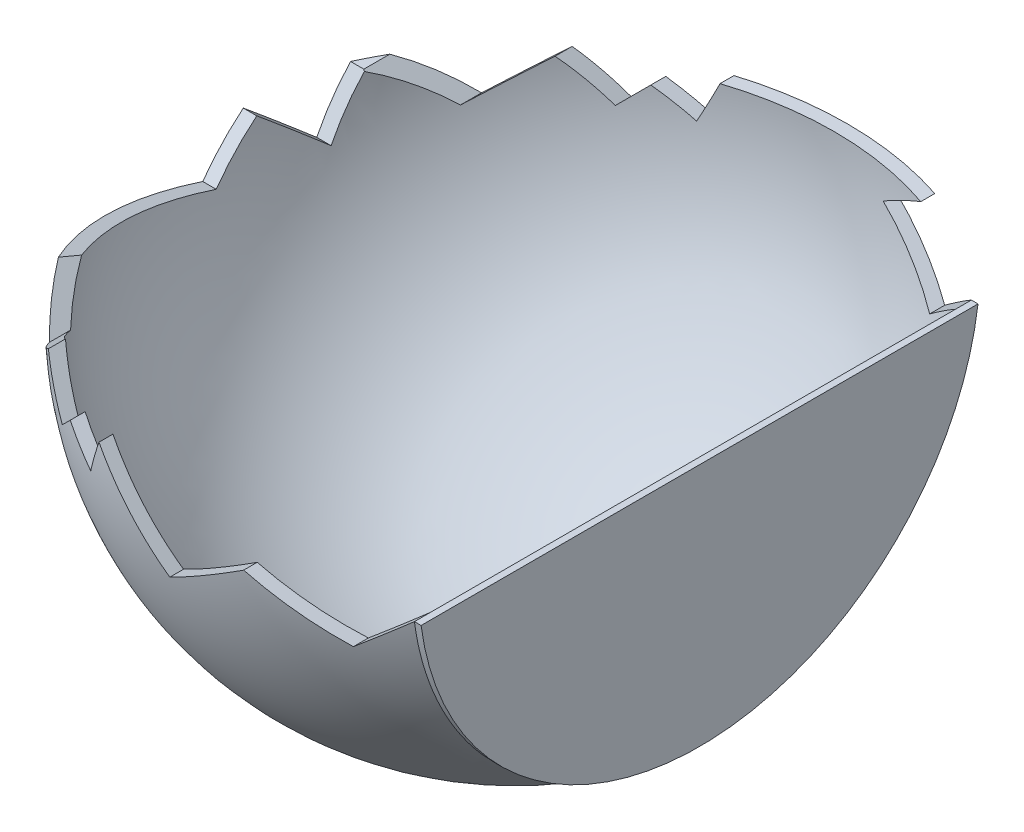
ISO-10303-21;
HEADER;
FILE_DESCRIPTION(('STEP AP214'),'2;1');
FILE_NAME('part.step','',(''),(''),'','','');
FILE_SCHEMA(('AUTOMOTIVE_DESIGN { 1 0 10303 214 1 1 1 1 }'));
ENDSEC;
DATA;
#1=APPLICATION_CONTEXT('core data for automotive mechanical design processes');
#2=APPLICATION_PROTOCOL_DEFINITION('international standard','automotive_design',2000,#1);
#3=PRODUCT_CONTEXT('',#1,'mechanical');
#4=PRODUCT('Part','Part','',(#3));
#5=PRODUCT_RELATED_PRODUCT_CATEGORY('part','',(#4));
#6=PRODUCT_DEFINITION_FORMATION('','',#4);
#7=PRODUCT_DEFINITION_CONTEXT('part definition',#1,'design');
#8=PRODUCT_DEFINITION('design','',#6,#7);
#9=PRODUCT_DEFINITION_SHAPE('','',#8);
#10=(LENGTH_UNIT() NAMED_UNIT(*) SI_UNIT(.MILLI.,.METRE.));
#11=(NAMED_UNIT(*) PLANE_ANGLE_UNIT() SI_UNIT($,.RADIAN.));
#12=(NAMED_UNIT(*) SI_UNIT($,.STERADIAN.) SOLID_ANGLE_UNIT());
#13=UNCERTAINTY_MEASURE_WITH_UNIT(LENGTH_MEASURE(1.E-05),#10,'distance_accuracy_value','');
#14=(GEOMETRIC_REPRESENTATION_CONTEXT(3) GLOBAL_UNCERTAINTY_ASSIGNED_CONTEXT((#13)) GLOBAL_UNIT_ASSIGNED_CONTEXT((#10,
#11,#12)) REPRESENTATION_CONTEXT('',''));
#15=CARTESIAN_POINT('',(0.,0.,0.));
#16=DIRECTION('',(0.,0.,1.));
#17=DIRECTION('',(1.,0.,0.));
#18=AXIS2_PLACEMENT_3D('',#15,#16,#17);
#19=CARTESIAN_POINT('',(0.,0.,0.));
#20=DIRECTION('',(0.,0.,-1.));
#21=DIRECTION('',(-1.,0.,0.));
#22=AXIS2_PLACEMENT_3D('',#19,#20,#21);
#23=SPHERICAL_SURFACE('',#22,50.);
#24=CARTESIAN_POINT('',(13.1016008554718,-16.4144462012753,0.));
#25=DIRECTION('',(0.623824939249041,-0.781564101767047,0.));
#26=DIRECTION('',(0.781564101767047,0.623824939249041,0.));
#27=AXIS2_PLACEMENT_3D('',#24,#25,#26);
#28=CIRCLE('',#27,45.3752576954593);
#29=CARTESIAN_POINT('',(26.7488940986448,-5.52151770176009,-41.8808966805707));
#30=VERTEX_POINT('',#29);
#31=CARTESIAN_POINT('',(20.1507949450474,-10.7879555976998,-44.4698265917994));
#32=VERTEX_POINT('',#31);
#33=EDGE_CURVE('E287',#30,#32,#28,.F.);
#34=ORIENTED_EDGE('',*,*,#33,.F.);
#35=CARTESIAN_POINT('',(26.7488940986448,0.,0.));
#36=DIRECTION('',(1.,0.,0.));
#37=DIRECTION('',(0.,0.,-1.));
#38=AXIS2_PLACEMENT_3D('',#35,#36,#37);
#39=CIRCLE('',#38,42.2433031911507);
#40=CARTESIAN_POINT('',(26.7488940986448,-5.52151770176009,41.8808966805707));
#41=VERTEX_POINT('',#40);
#42=EDGE_CURVE('E229',#30,#41,#39,.F.);
#43=ORIENTED_EDGE('',*,*,#42,.T.);
#44=CARTESIAN_POINT('',(20.1507949450474,-10.7879555976998,44.4698265917994));
#45=VERTEX_POINT('',#44);
#46=EDGE_CURVE('E371',#45,#41,#28,.F.);
#47=ORIENTED_EDGE('',*,*,#46,.F.);
#48=CARTESIAN_POINT('',(0.00667630332438472,0.0124521452759044,0.));
#49=DIRECTION('',(-0.472524466695166,-0.88131755251694,0.));
#50=DIRECTION('',(0.88131755251694,-0.472524466695166,0.));
#51=AXIS2_PLACEMENT_3D('',#48,#49,#50);
#52=CIRCLE('',#51,49.9999980037105);
#53=CARTESIAN_POINT('',(8.29204424355276,-4.42980485522153,49.1082358796121));
#54=VERTEX_POINT('',#53);
#55=EDGE_CURVE('E288',#54,#45,#52,.F.);
#56=ORIENTED_EDGE('',*,*,#55,.F.);
#57=CARTESIAN_POINT('',(4.16590882325636,-6.91542332610695,0.));
#58=DIRECTION('',(0.516011830102366,-0.856581456251772,0.));
#59=DIRECTION('',(0.856581456251772,0.516011830102366,0.));
#60=AXIS2_PLACEMENT_3D('',#57,#58,#59);
#61=CIRCLE('',#60,49.3439167871487);
#62=CARTESIAN_POINT('',(-3.37079886423975,-11.455599042482,48.5531354867503));
#63=VERTEX_POINT('',#62);
#64=EDGE_CURVE('E272',#63,#54,#61,.F.);
#65=ORIENTED_EDGE('',*,*,#64,.F.);
#66=CARTESIAN_POINT('',(-7.41319895336088,-7.41319895336077,0.));
#67=DIRECTION('',(-0.707106781186553,-0.707106781186543,0.));
#68=DIRECTION('',(0.707106781186543,-0.707106781186553,0.));
#69=AXIS2_PLACEMENT_3D('',#66,#67,#68);
#70=CIRCLE('',#69,48.8885361056739);
#71=CARTESIAN_POINT('',(-14.8263979067219,-1.04083408558608E-13,47.7512086246156));
#72=VERTEX_POINT('',#71);
#73=EDGE_CURVE('E275',#72,#63,#70,.F.);
#74=ORIENTED_EDGE('',*,*,#73,.F.);
#75=CARTESIAN_POINT('',(-12.5190832715597,5.3745198903049,0.));
#76=DIRECTION('',(0.918900395359216,-0.394489623955657,0.));
#77=DIRECTION('',(0.394489623955657,0.918900395359217,0.));
#78=AXIS2_PLACEMENT_3D('',#75,#76,#77);
#79=CIRCLE('',#78,48.1080771803288);
#80=CARTESIAN_POINT('',(-17.1772320436909,-5.47589159943955,46.6364375838076));
#81=VERTEX_POINT('',#80);
#82=EDGE_CURVE('E328',#81,#72,#79,.F.);
#83=ORIENTED_EDGE('',*,*,#82,.F.);
#84=CARTESIAN_POINT('',(-7.59457472056228,-11.6974410011386,0.));
#85=DIRECTION('',(-0.544546624083518,-0.838730573068159,0.));
#86=DIRECTION('',(0.83873057306816,-0.544546624083519,0.));
#87=AXIS2_PLACEMENT_3D('',#84,#85,#86);
#88=CIRCLE('',#87,48.0155423674322);
#89=CARTESIAN_POINT('',(-22.1167261591984,-2.26892033637887,44.7850692140382));
#90=VERTEX_POINT('',#89);
#91=EDGE_CURVE('E322',#90,#81,#88,.F.);
#92=ORIENTED_EDGE('',*,*,#91,.F.);
#93=CARTESIAN_POINT('',(-9.92390291141004,9.92390291140981,0.));
#94=DIRECTION('',(0.707106781186556,-0.707106781186539,0.));
#95=DIRECTION('',(0.707106781186539,0.707106781186556,0.));
#96=AXIS2_PLACEMENT_3D('',#93,#94,#95);
#97=CIRCLE('',#96,47.9899187539406);
#98=CARTESIAN_POINT('',(-25.323697422259,-5.47589159943955,42.7635938627363));
#99=VERTEX_POINT('',#98);
#100=EDGE_CURVE('E325',#99,#90,#97,.F.);
#101=ORIENTED_EDGE('',*,*,#100,.F.);
#102=CARTESIAN_POINT('',(-15.399794510849,-15.3997945108494,0.));
#103=DIRECTION('',(-0.707106781186539,-0.707106781186556,0.));
#104=DIRECTION('',(0.707106781186556,-0.707106781186539,0.));
#105=AXIS2_PLACEMENT_3D('',#102,#103,#104);
#106=CIRCLE('',#105,45.0076955425096);
#107=CARTESIAN_POINT('',(-30.7995890216985,-2.1163626406917E-13,39.3876289727431));
#108=VERTEX_POINT('',#107);
#109=EDGE_CURVE('E335',#108,#99,#106,.F.);
#110=ORIENTED_EDGE('',*,*,#109,.F.);
#111=CARTESIAN_POINT('',(-13.5582273830077,15.2892871478703,0.));
#112=DIRECTION('',(0.663481771908503,-0.748192447399165,0.));
#113=DIRECTION('',(0.748192447399165,0.663481771908503,0.));
#114=AXIS2_PLACEMENT_3D('',#111,#112,#113);
#115=CIRCLE('',#114,45.6334544905448);
#116=CARTESIAN_POINT('',(-37.528853710113,-5.96737440297733,32.4957779094397));
#117=VERTEX_POINT('',#116);
#118=EDGE_CURVE('E305',#117,#108,#115,.F.);
#119=ORIENTED_EDGE('',*,*,#118,.F.);
#120=CARTESIAN_POINT('',(-21.7481140565447,-21.7481140565452,0.));
#121=DIRECTION('',(-0.707106781186539,-0.707106781186556,0.));
#122=DIRECTION('',(0.707106781186556,-0.707106781186539,0.));
#123=AXIS2_PLACEMENT_3D('',#120,#121,#122);
#124=CIRCLE('',#123,39.4213022358093);
#125=CARTESIAN_POINT('',(-42.7348367923648,-0.76139132072567,25.9452116504505));
#126=VERTEX_POINT('',#125);
#127=EDGE_CURVE('E309',#126,#117,#124,.F.);
#128=ORIENTED_EDGE('',*,*,#127,.F.);
#129=CARTESIAN_POINT('',(0.,-7.16199971348181,1.9070129164996));
#130=DIRECTION('',(0.,-0.966330731100568,0.25730316385665));
#131=DIRECTION('',(0.,-0.25730316385665,-0.966330731100568));
#132=AXIS2_PLACEMENT_3D('',#129,#130,#131);
#133=CIRCLE('',#132,49.4476395982699);
#134=CARTESIAN_POINT('',(-49.2573386848287,-8.27715434258795,-2.28107467590438));
#135=VERTEX_POINT('',#134);
#136=EDGE_CURVE('E376',#135,#126,#133,.F.);
#137=ORIENTED_EDGE('',*,*,#136,.F.);
#138=CARTESIAN_POINT('',(0.,-5.01001590290923,-5.34401696310318));
#139=DIRECTION('',(0.,-0.68394112888133,-0.729537204140085));
#140=DIRECTION('',(0.,0.729537204140085,-0.68394112888133));
#141=AXIS2_PLACEMENT_3D('',#138,#139,#140);
#142=CIRCLE('',#141,49.4605016487971);
#143=CARTESIAN_POINT('',(-49.2603391991137,-1.76704411099221,-8.38430301802538));
#144=VERTEX_POINT('',#143);
#145=EDGE_CURVE('E374',#144,#135,#142,.F.);
#146=ORIENTED_EDGE('',*,*,#145,.F.);
#147=CARTESIAN_POINT('',(0.,2.9949732792852,-2.37225606280016));
#148=DIRECTION('',(0.,-0.78388842022198,0.620901718987707));
#149=DIRECTION('',(0.,-0.620901718987707,-0.78388842022198));
#150=AXIS2_PLACEMENT_3D('',#147,#148,#149);
#151=CIRCLE('',#150,49.8538116519577);
#152=CARTESIAN_POINT('',(-46.4307933857422,-8.27715434258795,-16.603317185415));
#153=VERTEX_POINT('',#152);
#154=EDGE_CURVE('E356',#153,#144,#151,.F.);
#155=ORIENTED_EDGE('',*,*,#154,.F.);
#156=CARTESIAN_POINT('',(0.,-8.3153587765948,-16.5841613433409));
#157=DIRECTION('',(0.,-0.448217108907809,-0.893924730210729));
#158=DIRECTION('',(0.,0.893924730210729,-0.448217108907809));
#159=AXIS2_PLACEMENT_3D('',#156,#157,#158);
#160=CIRCLE('',#159,46.4308130550666);
#161=CARTESIAN_POINT('',(-45.4894682388491,2.35092416057263E-13,-20.7535124580573));
#162=VERTEX_POINT('',#161);
#163=EDGE_CURVE('E381',#162,#153,#160,.F.);
#164=ORIENTED_EDGE('',*,*,#163,.F.);
#165=CARTESIAN_POINT('',(0.,0.,0.));
#166=DIRECTION('',(0.,-1.,0.));
#167=DIRECTION('',(0.,0.,1.));
#168=AXIS2_PLACEMENT_3D('',#165,#166,#167);
#169=CIRCLE('',#168,50.);
#170=CARTESIAN_POINT('',(-43.4962281130902,-3.03732537533837E-13,-24.6592404573625));
#171=VERTEX_POINT('',#170);
#172=EDGE_CURVE('E271',#162,#171,#169,.T.);
#173=ORIENTED_EDGE('',*,*,#172,.T.);
#174=CARTESIAN_POINT('',(-37.528853710113,-5.96737440297733,-32.4957779094397));
#175=VERTEX_POINT('',#174);
#176=EDGE_CURVE('E308',#175,#171,#124,.F.);
#177=ORIENTED_EDGE('',*,*,#176,.F.);
#178=CARTESIAN_POINT('',(-30.7995890216985,-2.15072380626596E-13,-39.3876289727431));
#179=VERTEX_POINT('',#178);
#180=EDGE_CURVE('E298',#179,#175,#115,.F.);
#181=ORIENTED_EDGE('',*,*,#180,.F.);
#182=CARTESIAN_POINT('',(-25.323697422259,-5.47589159943955,-42.7635938627363));
#183=VERTEX_POINT('',#182);
#184=EDGE_CURVE('E334',#183,#179,#106,.F.);
#185=ORIENTED_EDGE('',*,*,#184,.F.);
#186=CARTESIAN_POINT('',(-22.1167261591984,-2.26892033637887,-44.7850692140382));
#187=VERTEX_POINT('',#186);
#188=EDGE_CURVE('E324',#187,#183,#97,.F.);
#189=ORIENTED_EDGE('',*,*,#188,.F.);
#190=CARTESIAN_POINT('',(-17.1772320436909,-5.47589159943955,-46.6364375838076));
#191=VERTEX_POINT('',#190);
#192=EDGE_CURVE('E314',#191,#187,#88,.F.);
#193=ORIENTED_EDGE('',*,*,#192,.F.);
#194=CARTESIAN_POINT('',(-14.8263979067219,-1.03532183227165E-13,-47.7512086246155));
#195=VERTEX_POINT('',#194);
#196=EDGE_CURVE('E327',#195,#191,#79,.F.);
#197=ORIENTED_EDGE('',*,*,#196,.F.);
#198=CARTESIAN_POINT('',(15.6455359126181,1.09252193350212E-13,-47.4891272398954));
#199=VERTEX_POINT('',#198);
#200=EDGE_CURVE('E368',#195,#199,#169,.T.);
#201=ORIENTED_EDGE('',*,*,#200,.T.);
#202=CARTESIAN_POINT('',(4.16590882325637,-6.91542332610695,0.));
#203=DIRECTION('',(-0.516011830102366,0.856581456251772,0.));
#204=DIRECTION('',(-0.856581456251772,-0.516011830102367,0.));
#205=AXIS2_PLACEMENT_3D('',#202,#203,#204);
#206=CIRCLE('',#205,49.3439167871487);
#207=CARTESIAN_POINT('',(8.29204424355276,-4.42980485522153,-49.1082358796121));
#208=VERTEX_POINT('',#207);
#209=EDGE_CURVE('E282',#208,#199,#206,.F.);
#210=ORIENTED_EDGE('',*,*,#209,.F.);
#211=EDGE_CURVE('E291',#32,#208,#52,.F.);
#212=ORIENTED_EDGE('',*,*,#211,.F.);
#213=EDGE_LOOP('',(#34,#43,#47,#56,#65,#74,#83,#92,#101,#110,#119,#128,#137,#146,#155,#164,#173,
#177,#181,#185,#189,#193,#197,#201,#210,#212));
#214=FACE_BOUND('',#213,.T.);
#215=ADVANCED_FACE('F34',(#214),#23,.T.);
#216=CARTESIAN_POINT('',(0.,0.,0.));
#217=DIRECTION('',(0.,0.,-1.));
#218=DIRECTION('',(-1.,0.,0.));
#219=AXIS2_PLACEMENT_3D('',#216,#217,#218);
#220=SPHERICAL_SURFACE('',#219,48.);
#221=CARTESIAN_POINT('',(26.7488940986448,0.,0.));
#222=DIRECTION('',(1.,0.,0.));
#223=DIRECTION('',(0.,0.,-1.));
#224=AXIS2_PLACEMENT_3D('',#221,#222,#223);
#225=CIRCLE('',#224,39.8559489223313);
#226=CARTESIAN_POINT('',(26.7488940986448,-5.52151770176009,-39.4716291375038));
#227=VERTEX_POINT('',#226);
#228=CARTESIAN_POINT('',(26.7488940986448,-5.52151770176009,39.4716291375037));
#229=VERTEX_POINT('',#228);
#230=EDGE_CURVE('E359',#227,#229,#225,.F.);
#231=ORIENTED_EDGE('',*,*,#230,.F.);
#232=CARTESIAN_POINT('',(13.1016008554718,-16.4144462012753,0.));
#233=DIRECTION('',(0.623824939249041,-0.781564101767047,0.));
#234=DIRECTION('',(0.781564101767047,0.623824939249041,0.));
#235=AXIS2_PLACEMENT_3D('',#232,#233,#234);
#236=CIRCLE('',#235,43.1614875893932);
#237=CARTESIAN_POINT('',(20.1507949450474,-10.7879555976998,-42.2085948250437));
#238=VERTEX_POINT('',#237);
#239=EDGE_CURVE('E260',#227,#238,#236,.F.);
#240=ORIENTED_EDGE('',*,*,#239,.T.);
#241=CARTESIAN_POINT('',(0.00667630332438472,0.0124521452759044,0.));
#242=DIRECTION('',(-0.472524466695166,-0.88131755251694,0.));
#243=DIRECTION('',(0.88131755251694,-0.472524466695166,0.));
#244=AXIS2_PLACEMENT_3D('',#241,#242,#243);
#245=CIRCLE('',#244,47.9999979205317);
#246=CARTESIAN_POINT('',(8.29204424355276,-4.42980485522153,-47.070360432098));
#247=VERTEX_POINT('',#246);
#248=EDGE_CURVE('E290',#238,#247,#245,.F.);
#249=ORIENTED_EDGE('',*,*,#248,.T.);
#250=CARTESIAN_POINT('',(4.16590882325637,-6.91542332610695,0.));
#251=DIRECTION('',(-0.516011830102366,0.856581456251772,0.));
#252=DIRECTION('',(-0.856581456251772,-0.516011830102367,0.));
#253=AXIS2_PLACEMENT_3D('',#250,#251,#252);
#254=CIRCLE('',#253,47.3161930410409);
#255=CARTESIAN_POINT('',(15.6455359126181,1.09252193350212E-13,-45.3785985460875));
#256=VERTEX_POINT('',#255);
#257=EDGE_CURVE('E257',#247,#256,#254,.F.);
#258=ORIENTED_EDGE('',*,*,#257,.T.);
#259=CARTESIAN_POINT('',(0.,0.,0.));
#260=DIRECTION('',(0.,-1.,0.));
#261=DIRECTION('',(1.,0.,0.));
#262=AXIS2_PLACEMENT_3D('',#259,#260,#261);
#263=CIRCLE('',#262,48.);
#264=CARTESIAN_POINT('',(-14.8263979067219,-1.03532183227165E-13,-45.6527975606266));
#265=VERTEX_POINT('',#264);
#266=EDGE_CURVE('E276',#265,#256,#263,.T.);
#267=ORIENTED_EDGE('',*,*,#266,.F.);
#268=CARTESIAN_POINT('',(-12.5190832715597,5.3745198903049,0.));
#269=DIRECTION('',(0.918900395359216,-0.394489623955657,0.));
#270=DIRECTION('',(0.394489623955657,0.918900395359217,0.));
#271=AXIS2_PLACEMENT_3D('',#268,#269,#270);
#272=CIRCLE('',#271,46.0259393167426);
#273=CARTESIAN_POINT('',(-17.1772320436909,-5.47589159943955,-44.4854730278142));
#274=VERTEX_POINT('',#273);
#275=EDGE_CURVE('E330',#265,#274,#272,.F.);
#276=ORIENTED_EDGE('',*,*,#275,.T.);
#277=CARTESIAN_POINT('',(-7.59457472056228,-11.6974410011386,0.));
#278=DIRECTION('',(-0.544546624083518,-0.838730573068159,0.));
#279=DIRECTION('',(0.83873057306816,-0.544546624083519,0.));
#280=AXIS2_PLACEMENT_3D('',#277,#278,#279);
#281=CIRCLE('',#280,45.9292097563052);
#282=CARTESIAN_POINT('',(-22.1167261591984,-2.26892033637887,-42.5405973689392));
#283=VERTEX_POINT('',#282);
#284=EDGE_CURVE('E242',#274,#283,#281,.F.);
#285=ORIENTED_EDGE('',*,*,#284,.T.);
#286=CARTESIAN_POINT('',(-9.92390291141004,9.92390291140981,0.));
#287=DIRECTION('',(0.707106781186556,-0.707106781186539,0.));
#288=DIRECTION('',(0.707106781186539,0.707106781186556,0.));
#289=AXIS2_PLACEMENT_3D('',#286,#287,#288);
#290=CIRCLE('',#289,45.9024215266452);
#291=CARTESIAN_POINT('',(-25.323697422259,-5.47589159943955,-40.4069914749547));
#292=VERTEX_POINT('',#291);
#293=EDGE_CURVE('E247',#283,#292,#290,.F.);
#294=ORIENTED_EDGE('',*,*,#293,.T.);
#295=CARTESIAN_POINT('',(-15.399794510849,-15.3997945108494,0.));
#296=DIRECTION('',(-0.707106781186539,-0.707106781186556,0.));
#297=DIRECTION('',(0.707106781186556,-0.707106781186539,0.));
#298=AXIS2_PLACEMENT_3D('',#295,#296,#297);
#299=CIRCLE('',#298,42.7749068736244);
#300=CARTESIAN_POINT('',(-30.7995890216985,-2.1163626406917E-13,-36.8155580712077));
#301=VERTEX_POINT('',#300);
#302=EDGE_CURVE('E337',#292,#301,#299,.F.);
#303=ORIENTED_EDGE('',*,*,#302,.T.);
#304=CARTESIAN_POINT('',(-13.5582273830077,15.2892871478703,0.));
#305=DIRECTION('',(0.663481771908503,-0.748192447399165,0.));
#306=DIRECTION('',(0.748192447399165,0.663481771908503,0.));
#307=AXIS2_PLACEMENT_3D('',#304,#305,#306);
#308=CIRCLE('',#307,43.4328466571169);
#309=CARTESIAN_POINT('',(-37.528853710113,-5.96737440297733,-29.3253402698013));
#310=VERTEX_POINT('',#309);
#311=EDGE_CURVE('E250',#301,#310,#308,.F.);
#312=ORIENTED_EDGE('',*,*,#311,.T.);
#313=CARTESIAN_POINT('',(-21.7481140565447,-21.7481140565452,0.));
#314=DIRECTION('',(-0.707106781186539,-0.707106781186556,0.));
#315=DIRECTION('',(0.707106781186556,-0.707106781186539,0.));
#316=AXIS2_PLACEMENT_3D('',#313,#314,#315);
#317=CIRCLE('',#316,36.851581648106);
#318=CARTESIAN_POINT('',(-43.32278531579,-0.173442797300485,-20.6665476090719));
#319=VERTEX_POINT('',#318);
#320=EDGE_CURVE('E255',#310,#319,#317,.F.);
#321=ORIENTED_EDGE('',*,*,#320,.T.);
#322=CARTESIAN_POINT('',(0.,-8.3153587765948,-16.5841613433409));
#323=DIRECTION('',(0.,-0.448217108907809,-0.893924730210729));
#324=DIRECTION('',(0.,0.893924730210729,-0.448217108907809));
#325=AXIS2_PLACEMENT_3D('',#322,#323,#324);
#326=CIRCLE('',#325,44.2698588314278);
#327=CARTESIAN_POINT('',(-44.2698382019799,-8.27715434258795,-16.603317185415));
#328=VERTEX_POINT('',#327);
#329=EDGE_CURVE('E383',#319,#328,#326,.F.);
#330=ORIENTED_EDGE('',*,*,#329,.T.);
#331=CARTESIAN_POINT('',(0.,2.9949732792852,-2.37225606280016));
#332=DIRECTION('',(0.,-0.78388842022198,0.620901718987707));
#333=DIRECTION('',(0.,-0.620901718987707,-0.78388842022198));
#334=AXIS2_PLACEMENT_3D('',#331,#332,#333);
#335=CIRCLE('',#334,47.8477014727863);
#336=CARTESIAN_POINT('',(-47.229027282083,-1.76704411099221,-8.38430301802538));
#337=VERTEX_POINT('',#336);
#338=EDGE_CURVE('E358',#328,#337,#335,.F.);
#339=ORIENTED_EDGE('',*,*,#338,.T.);
#340=CARTESIAN_POINT('',(0.,-5.01001590290923,-5.34401696310318));
#341=DIRECTION('',(0.,-0.68394112888133,-0.729537204140085));
#342=DIRECTION('',(0.,0.729537204140085,-0.68394112888133));
#343=AXIS2_PLACEMENT_3D('',#340,#341,#342);
#344=CIRCLE('',#343,47.4377615760974);
#345=CARTESIAN_POINT('',(-47.2258977078459,-8.27715434258795,-2.28107467590438));
#346=VERTEX_POINT('',#345);
#347=EDGE_CURVE('E240',#337,#346,#344,.F.);
#348=ORIENTED_EDGE('',*,*,#347,.T.);
#349=CARTESIAN_POINT('',(0.,-7.16199971348181,1.9070129164996));
#350=DIRECTION('',(0.,-0.966330731100568,0.25730316385665));
#351=DIRECTION('',(0.,-0.25730316385665,-0.966330731100568));
#352=AXIS2_PLACEMENT_3D('',#349,#350,#351);
#353=CIRCLE('',#352,47.4243509374708);
#354=CARTESIAN_POINT('',(-42.0007689135171,-1.49545919957331,23.1883378545282));
#355=VERTEX_POINT('',#354);
#356=EDGE_CURVE('E378',#346,#355,#353,.F.);
#357=ORIENTED_EDGE('',*,*,#356,.T.);
#358=CARTESIAN_POINT('',(-37.528853710113,-5.96737440297733,29.3253402698013));
#359=VERTEX_POINT('',#358);
#360=EDGE_CURVE('E254',#355,#359,#317,.F.);
#361=ORIENTED_EDGE('',*,*,#360,.T.);
#362=CARTESIAN_POINT('',(-30.7995890216985,-2.15072380626596E-13,36.8155580712077));
#363=VERTEX_POINT('',#362);
#364=EDGE_CURVE('E251',#359,#363,#308,.F.);
#365=ORIENTED_EDGE('',*,*,#364,.T.);
#366=CARTESIAN_POINT('',(-25.323697422259,-5.47589159943955,40.4069914749547));
#367=VERTEX_POINT('',#366);
#368=EDGE_CURVE('E338',#363,#367,#299,.F.);
#369=ORIENTED_EDGE('',*,*,#368,.T.);
#370=CARTESIAN_POINT('',(-22.1167261591984,-2.26892033637887,42.5405973689392));
#371=VERTEX_POINT('',#370);
#372=EDGE_CURVE('E246',#367,#371,#290,.F.);
#373=ORIENTED_EDGE('',*,*,#372,.T.);
#374=CARTESIAN_POINT('',(-17.1772320436909,-5.47589159943955,44.4854730278142));
#375=VERTEX_POINT('',#374);
#376=EDGE_CURVE('E243',#371,#375,#281,.F.);
#377=ORIENTED_EDGE('',*,*,#376,.T.);
#378=CARTESIAN_POINT('',(-14.8263979067219,-1.04083408558608E-13,45.6527975606266));
#379=VERTEX_POINT('',#378);
#380=EDGE_CURVE('E331',#375,#379,#272,.F.);
#381=ORIENTED_EDGE('',*,*,#380,.T.);
#382=CARTESIAN_POINT('',(-7.41319895336088,-7.41319895336077,0.));
#383=DIRECTION('',(-0.707106781186553,-0.707106781186543,0.));
#384=DIRECTION('',(0.707106781186543,-0.707106781186553,0.));
#385=AXIS2_PLACEMENT_3D('',#382,#383,#384);
#386=CIRCLE('',#385,46.8411033447738);
#387=CARTESIAN_POINT('',(-3.37079886423975,-11.455599042482,46.4909342301779));
#388=VERTEX_POINT('',#387);
#389=EDGE_CURVE('E268',#379,#388,#386,.F.);
#390=ORIENTED_EDGE('',*,*,#389,.T.);
#391=CARTESIAN_POINT('',(4.16590882325636,-6.91542332610695,0.));
#392=DIRECTION('',(0.516011830102366,-0.856581456251772,0.));
#393=DIRECTION('',(0.856581456251772,0.516011830102366,0.));
#394=AXIS2_PLACEMENT_3D('',#391,#392,#393);
#395=CIRCLE('',#394,47.3161930410409);
#396=CARTESIAN_POINT('',(8.29204424355276,-4.42980485522153,47.070360432098));
#397=VERTEX_POINT('',#396);
#398=EDGE_CURVE('E264',#388,#397,#395,.F.);
#399=ORIENTED_EDGE('',*,*,#398,.T.);
#400=CARTESIAN_POINT('',(20.1507949450474,-10.7879555976998,42.2085948250437));
#401=VERTEX_POINT('',#400);
#402=EDGE_CURVE('E292',#397,#401,#245,.F.);
#403=ORIENTED_EDGE('',*,*,#402,.T.);
#404=EDGE_CURVE('E265',#401,#229,#236,.F.);
#405=ORIENTED_EDGE('',*,*,#404,.T.);
#406=EDGE_LOOP('',(#231,#240,#249,#258,#267,#276,#285,#294,#303,#312,#321,#330,#339,#348,#357,
#361,#365,#369,#373,#377,#381,#390,#399,#403,#405));
#407=FACE_BOUND('',#406,.T.);
#408=ADVANCED_FACE('F400',(#407),#220,.F.);
#409=CARTESIAN_POINT('',(20.1507949450474,-10.7879555976998,-50.));
#410=DIRECTION('',(0.623824939249041,-0.781564101767047,0.));
#411=DIRECTION('',(0.781564101767047,0.623824939249041,0.));
#412=AXIS2_PLACEMENT_3D('',#409,#410,#411);
#413=PLANE('',#412);
#414=DIRECTION('',(0.,0.,1.));
#415=VECTOR('',#414,1.);
#416=CARTESIAN_POINT('',(26.7488940986448,-5.52151770176009,-50.));
#417=LINE('',#416,#415);
#418=EDGE_CURVE('E232',#229,#41,#417,.T.);
#419=ORIENTED_EDGE('',*,*,#418,.F.);
#420=ORIENTED_EDGE('',*,*,#404,.F.);
#421=DIRECTION('',(0.,0.,1.));
#422=VECTOR('',#421,1.);
#423=CARTESIAN_POINT('',(20.1507949450474,-10.7879555976998,-50.));
#424=LINE('',#423,#422);
#425=EDGE_CURVE('E299',#401,#45,#424,.T.);
#426=ORIENTED_EDGE('',*,*,#425,.T.);
#427=ORIENTED_EDGE('',*,*,#46,.T.);
#428=EDGE_LOOP('',(#419,#420,#426,#427));
#429=FACE_BOUND('',#428,.T.);
#430=ADVANCED_FACE('F36',(#429),#413,.F.);
#431=DIRECTION('',(0.,0.,1.));
#432=VECTOR('',#431,1.);
#433=CARTESIAN_POINT('',(26.7488940986448,-5.52151770176009,-50.));
#434=LINE('',#433,#432);
#435=EDGE_CURVE('E230',#30,#227,#434,.T.);
#436=ORIENTED_EDGE('',*,*,#435,.F.);
#437=ORIENTED_EDGE('',*,*,#33,.T.);
#438=EDGE_CURVE('E302',#32,#238,#424,.T.);
#439=ORIENTED_EDGE('',*,*,#438,.T.);
#440=ORIENTED_EDGE('',*,*,#239,.F.);
#441=EDGE_LOOP('',(#436,#437,#439,#440));
#442=FACE_BOUND('',#441,.T.);
#443=ADVANCED_FACE('F466',(#442),#413,.F.);
#444=CARTESIAN_POINT('',(0.,0.,0.));
#445=DIRECTION('',(0.,-1.,0.));
#446=DIRECTION('',(0.,0.,1.));
#447=AXIS2_PLACEMENT_3D('',#444,#445,#446);
#448=PLANE('',#447);
#449=ORIENTED_EDGE('',*,*,#200,.F.);
#450=DIRECTION('',(0.,0.,1.));
#451=VECTOR('',#450,1.);
#452=CARTESIAN_POINT('',(-14.8263979067219,-1.04083408558608E-13,-50.));
#453=LINE('',#452,#451);
#454=EDGE_CURVE('E345',#195,#265,#453,.T.);
#455=ORIENTED_EDGE('',*,*,#454,.T.);
#456=ORIENTED_EDGE('',*,*,#266,.T.);
#457=DIRECTION('',(0.,0.,1.));
#458=VECTOR('',#457,1.);
#459=CARTESIAN_POINT('',(15.6455359126181,1.09252193350212E-13,-50.));
#460=LINE('',#459,#458);
#461=EDGE_CURVE('E295',#199,#256,#460,.T.);
#462=ORIENTED_EDGE('',*,*,#461,.F.);
#463=EDGE_LOOP('',(#449,#455,#456,#462));
#464=FACE_BOUND('',#463,.T.);
#465=ADVANCED_FACE('F450',(#464),#448,.F.);
#466=ORIENTED_EDGE('',*,*,#172,.F.);
#467=DIRECTION('',(1.,0.,0.));
#468=VECTOR('',#467,1.);
#469=CARTESIAN_POINT('',(-100.,2.35922392732846E-13,-20.7535124580573));
#470=LINE('',#469,#468);
#471=CARTESIAN_POINT('',(-43.4962281130907,2.35922392732846E-13,-20.7535124580573));
#472=VERTEX_POINT('',#471);
#473=EDGE_CURVE('E12',#162,#472,#470,.T.);
#474=ORIENTED_EDGE('',*,*,#473,.T.);
#475=DIRECTION('',(0.,0.,1.));
#476=VECTOR('',#475,1.);
#477=CARTESIAN_POINT('',(-43.4962281130902,-3.05311331771918E-13,-50.));
#478=LINE('',#477,#476);
#479=EDGE_CURVE('E316',#171,#472,#478,.T.);
#480=ORIENTED_EDGE('',*,*,#479,.F.);
#481=EDGE_LOOP('',(#466,#474,#480));
#482=FACE_BOUND('',#481,.T.);
#483=ADVANCED_FACE('F414',(#482),#448,.F.);
#484=CARTESIAN_POINT('',(-3.37079886423975,-11.455599042482,40.));
#485=DIRECTION('',(0.516011830102366,-0.856581456251772,0.));
#486=DIRECTION('',(0.856581456251772,0.516011830102366,0.));
#487=AXIS2_PLACEMENT_3D('',#484,#485,#486);
#488=PLANE('',#487);
#489=ORIENTED_EDGE('',*,*,#64,.T.);
#490=DIRECTION('',(0.,0.,-1.));
#491=VECTOR('',#490,1.);
#492=CARTESIAN_POINT('',(8.29204424355276,-4.42980485522153,40.));
#493=LINE('',#492,#491);
#494=EDGE_CURVE('E261',#54,#397,#493,.T.);
#495=ORIENTED_EDGE('',*,*,#494,.T.);
#496=ORIENTED_EDGE('',*,*,#398,.F.);
#497=DIRECTION('',(0.,0.,1.));
#498=VECTOR('',#497,1.);
#499=CARTESIAN_POINT('',(-3.37079886423975,-11.455599042482,40.));
#500=LINE('',#499,#498);
#501=EDGE_CURVE('E278',#388,#63,#500,.T.);
#502=ORIENTED_EDGE('',*,*,#501,.T.);
#503=EDGE_LOOP('',(#489,#495,#496,#502));
#504=FACE_BOUND('',#503,.T.);
#505=ADVANCED_FACE('F480',(#504),#488,.F.);
#506=CARTESIAN_POINT('',(-14.8263979067219,3.35182208528941E-13,40.));
#507=DIRECTION('',(-0.707106781186553,-0.707106781186543,0.));
#508=DIRECTION('',(0.707106781186543,-0.707106781186553,0.));
#509=AXIS2_PLACEMENT_3D('',#506,#507,#508);
#510=PLANE('',#509);
#511=ORIENTED_EDGE('',*,*,#73,.T.);
#512=ORIENTED_EDGE('',*,*,#501,.F.);
#513=ORIENTED_EDGE('',*,*,#389,.F.);
#514=DIRECTION('',(0.,0.,1.));
#515=VECTOR('',#514,1.);
#516=CARTESIAN_POINT('',(-14.8263979067219,3.35182208528941E-13,40.));
#517=LINE('',#516,#515);
#518=EDGE_CURVE('E279',#379,#72,#517,.T.);
#519=ORIENTED_EDGE('',*,*,#518,.T.);
#520=EDGE_LOOP('',(#511,#512,#513,#519));
#521=FACE_BOUND('',#520,.T.);
#522=ADVANCED_FACE('F486',(#521),#510,.F.);
#523=CARTESIAN_POINT('',(8.29204424355276,-4.42980485522153,-50.));
#524=DIRECTION('',(-0.472524466695166,-0.88131755251694,0.));
#525=DIRECTION('',(0.88131755251694,-0.472524466695166,0.));
#526=AXIS2_PLACEMENT_3D('',#523,#524,#525);
#527=PLANE('',#526);
#528=ORIENTED_EDGE('',*,*,#55,.T.);
#529=ORIENTED_EDGE('',*,*,#425,.F.);
#530=ORIENTED_EDGE('',*,*,#402,.F.);
#531=ORIENTED_EDGE('',*,*,#494,.F.);
#532=EDGE_LOOP('',(#528,#529,#530,#531));
#533=FACE_BOUND('',#532,.T.);
#534=ADVANCED_FACE('F478',(#533),#527,.F.);
#535=CARTESIAN_POINT('',(8.29204424355276,-4.42980485522153,-50.));
#536=DIRECTION('',(-0.516011830102366,0.856581456251772,0.));
#537=DIRECTION('',(-0.856581456251772,-0.516011830102367,0.));
#538=AXIS2_PLACEMENT_3D('',#535,#536,#537);
#539=PLANE('',#538);
#540=ORIENTED_EDGE('',*,*,#209,.T.);
#541=ORIENTED_EDGE('',*,*,#461,.T.);
#542=ORIENTED_EDGE('',*,*,#257,.F.);
#543=DIRECTION('',(0.,0.,1.));
#544=VECTOR('',#543,1.);
#545=CARTESIAN_POINT('',(8.29204424355276,-4.42980485522153,-50.));
#546=LINE('',#545,#544);
#547=EDGE_CURVE('E296',#208,#247,#546,.T.);
#548=ORIENTED_EDGE('',*,*,#547,.F.);
#549=EDGE_LOOP('',(#540,#541,#542,#548));
#550=FACE_BOUND('',#549,.T.);
#551=ADVANCED_FACE('F454',(#550),#539,.F.);
#552=ORIENTED_EDGE('',*,*,#211,.T.);
#553=ORIENTED_EDGE('',*,*,#547,.T.);
#554=ORIENTED_EDGE('',*,*,#248,.F.);
#555=ORIENTED_EDGE('',*,*,#438,.F.);
#556=EDGE_LOOP('',(#552,#553,#554,#555));
#557=FACE_BOUND('',#556,.T.);
#558=ADVANCED_FACE('F462',(#557),#527,.F.);
#559=CARTESIAN_POINT('',(-21.7481140565447,-21.7481140565452,-50.));
#560=DIRECTION('',(-0.707106781186539,-0.707106781186556,0.));
#561=DIRECTION('',(0.707106781186556,-0.707106781186539,0.));
#562=AXIS2_PLACEMENT_3D('',#559,#560,#561);
#563=PLANE('',#562);
#564=ORIENTED_EDGE('',*,*,#360,.F.);
#565=DIRECTION('',(-0.249186658087152,0.249186658087146,0.935848288379435));
#566=VECTOR('',#565,1.);
#567=CARTESIAN_POINT('',(-22.4180457911517,-21.0781823219383,-50.3567630612058));
#568=LINE('',#567,#566);
#569=EDGE_CURVE('E237',#355,#126,#568,.T.);
#570=ORIENTED_EDGE('',*,*,#569,.T.);
#571=ORIENTED_EDGE('',*,*,#127,.T.);
#572=DIRECTION('',(0.,0.,1.));
#573=VECTOR('',#572,1.);
#574=CARTESIAN_POINT('',(-37.528853710113,-5.96737440297733,-50.));
#575=LINE('',#574,#573);
#576=EDGE_CURVE('E319',#359,#117,#575,.T.);
#577=ORIENTED_EDGE('',*,*,#576,.F.);
#578=EDGE_LOOP('',(#564,#570,#571,#577));
#579=FACE_BOUND('',#578,.T.);
#580=ADVANCED_FACE('F508',(#579),#563,.F.);
#581=CARTESIAN_POINT('',(-13.5582273830077,15.2892871478703,-50.));
#582=DIRECTION('',(0.663481771908503,-0.748192447399165,0.));
#583=DIRECTION('',(0.748192447399165,0.663481771908503,0.));
#584=AXIS2_PLACEMENT_3D('',#581,#582,#583);
#585=PLANE('',#584);
#586=ORIENTED_EDGE('',*,*,#118,.T.);
#587=DIRECTION('',(0.,0.,1.));
#588=VECTOR('',#587,1.);
#589=CARTESIAN_POINT('',(-30.7995890216985,-2.1163626406917E-13,-50.));
#590=LINE('',#589,#588);
#591=EDGE_CURVE('E312',#363,#108,#590,.T.);
#592=ORIENTED_EDGE('',*,*,#591,.F.);
#593=ORIENTED_EDGE('',*,*,#364,.F.);
#594=ORIENTED_EDGE('',*,*,#576,.T.);
#595=EDGE_LOOP('',(#586,#592,#593,#594));
#596=FACE_BOUND('',#595,.T.);
#597=ADVANCED_FACE('F504',(#596),#585,.F.);
#598=ORIENTED_EDGE('',*,*,#180,.T.);
#599=EDGE_CURVE('E311',#175,#310,#575,.T.);
#600=ORIENTED_EDGE('',*,*,#599,.T.);
#601=ORIENTED_EDGE('',*,*,#311,.F.);
#602=EDGE_CURVE('E315',#179,#301,#590,.T.);
#603=ORIENTED_EDGE('',*,*,#602,.F.);
#604=EDGE_LOOP('',(#598,#600,#601,#603));
#605=FACE_BOUND('',#604,.T.);
#606=ADVANCED_FACE('F424',(#605),#585,.F.);
#607=ORIENTED_EDGE('',*,*,#479,.T.);
#608=DIRECTION('',(0.666458526415744,-0.666458526415728,0.334164727545459));
#609=VECTOR('',#608,1.);
#610=CARTESIAN_POINT('',(-30.6900358866775,-12.8061922264127,-14.3324411286095));
#611=LINE('',#610,#609);
#612=EDGE_CURVE('E52',#472,#319,#611,.T.);
#613=ORIENTED_EDGE('',*,*,#612,.T.);
#614=ORIENTED_EDGE('',*,*,#320,.F.);
#615=ORIENTED_EDGE('',*,*,#599,.F.);
#616=ORIENTED_EDGE('',*,*,#176,.T.);
#617=EDGE_LOOP('',(#607,#613,#614,#615,#616));
#618=FACE_BOUND('',#617,.T.);
#619=ADVANCED_FACE('F416',(#618),#563,.F.);
#620=CARTESIAN_POINT('',(-15.399794510849,-15.3997945108494,-50.));
#621=DIRECTION('',(-0.707106781186539,-0.707106781186556,0.));
#622=DIRECTION('',(0.707106781186556,-0.707106781186539,0.));
#623=AXIS2_PLACEMENT_3D('',#620,#621,#622);
#624=PLANE('',#623);
#625=ORIENTED_EDGE('',*,*,#184,.T.);
#626=ORIENTED_EDGE('',*,*,#602,.T.);
#627=ORIENTED_EDGE('',*,*,#302,.F.);
#628=DIRECTION('',(0.,0.,1.));
#629=VECTOR('',#628,1.);
#630=CARTESIAN_POINT('',(-25.323697422259,-5.47589159943955,-50.));
#631=LINE('',#630,#629);
#632=EDGE_CURVE('E341',#183,#292,#631,.T.);
#633=ORIENTED_EDGE('',*,*,#632,.F.);
#634=EDGE_LOOP('',(#625,#626,#627,#633));
#635=FACE_BOUND('',#634,.T.);
#636=ADVANCED_FACE('F429',(#635),#624,.F.);
#637=CARTESIAN_POINT('',(-9.92390291141004,9.9239029114098,-50.));
#638=DIRECTION('',(0.707106781186556,-0.707106781186539,0.));
#639=DIRECTION('',(0.707106781186539,0.707106781186556,0.));
#640=AXIS2_PLACEMENT_3D('',#637,#638,#639);
#641=PLANE('',#640);
#642=ORIENTED_EDGE('',*,*,#188,.T.);
#643=ORIENTED_EDGE('',*,*,#632,.T.);
#644=ORIENTED_EDGE('',*,*,#293,.F.);
#645=DIRECTION('',(0.,0.,1.));
#646=VECTOR('',#645,1.);
#647=CARTESIAN_POINT('',(-22.1167261591984,-2.26892033637887,-50.));
#648=LINE('',#647,#646);
#649=EDGE_CURVE('E350',#187,#283,#648,.T.);
#650=ORIENTED_EDGE('',*,*,#649,.F.);
#651=EDGE_LOOP('',(#642,#643,#644,#650));
#652=FACE_BOUND('',#651,.T.);
#653=ADVANCED_FACE('F438',(#652),#641,.F.);
#654=CARTESIAN_POINT('',(-7.59457472056228,-11.6974410011386,-50.));
#655=DIRECTION('',(-0.544546624083518,-0.838730573068159,0.));
#656=DIRECTION('',(0.83873057306816,-0.544546624083519,0.));
#657=AXIS2_PLACEMENT_3D('',#654,#655,#656);
#658=PLANE('',#657);
#659=ORIENTED_EDGE('',*,*,#192,.T.);
#660=ORIENTED_EDGE('',*,*,#649,.T.);
#661=ORIENTED_EDGE('',*,*,#284,.F.);
#662=DIRECTION('',(0.,0.,1.));
#663=VECTOR('',#662,1.);
#664=CARTESIAN_POINT('',(-17.1772320436909,-5.47589159943955,-50.));
#665=LINE('',#664,#663);
#666=EDGE_CURVE('E346',#191,#274,#665,.T.);
#667=ORIENTED_EDGE('',*,*,#666,.F.);
#668=EDGE_LOOP('',(#659,#660,#661,#667));
#669=FACE_BOUND('',#668,.T.);
#670=ADVANCED_FACE('F440',(#669),#658,.F.);
#671=CARTESIAN_POINT('',(-12.5190832715597,5.3745198903049,-50.));
#672=DIRECTION('',(0.918900395359216,-0.394489623955657,0.));
#673=DIRECTION('',(0.394489623955657,0.918900395359217,0.));
#674=AXIS2_PLACEMENT_3D('',#671,#672,#673);
#675=PLANE('',#674);
#676=ORIENTED_EDGE('',*,*,#196,.T.);
#677=ORIENTED_EDGE('',*,*,#666,.T.);
#678=ORIENTED_EDGE('',*,*,#275,.F.);
#679=ORIENTED_EDGE('',*,*,#454,.F.);
#680=EDGE_LOOP('',(#676,#677,#678,#679));
#681=FACE_BOUND('',#680,.T.);
#682=ADVANCED_FACE('F587',(#681),#675,.F.);
#683=ORIENTED_EDGE('',*,*,#91,.T.);
#684=EDGE_CURVE('E342',#375,#81,#665,.T.);
#685=ORIENTED_EDGE('',*,*,#684,.F.);
#686=ORIENTED_EDGE('',*,*,#376,.F.);
#687=EDGE_CURVE('E347',#371,#90,#648,.T.);
#688=ORIENTED_EDGE('',*,*,#687,.T.);
#689=EDGE_LOOP('',(#683,#685,#686,#688));
#690=FACE_BOUND('',#689,.T.);
#691=ADVANCED_FACE('F493',(#690),#658,.F.);
#692=ORIENTED_EDGE('',*,*,#100,.T.);
#693=ORIENTED_EDGE('',*,*,#687,.F.);
#694=ORIENTED_EDGE('',*,*,#372,.F.);
#695=EDGE_CURVE('E351',#367,#99,#631,.T.);
#696=ORIENTED_EDGE('',*,*,#695,.T.);
#697=EDGE_LOOP('',(#692,#693,#694,#696));
#698=FACE_BOUND('',#697,.T.);
#699=ADVANCED_FACE('F495',(#698),#641,.F.);
#700=ORIENTED_EDGE('',*,*,#82,.T.);
#701=ORIENTED_EDGE('',*,*,#518,.F.);
#702=ORIENTED_EDGE('',*,*,#380,.F.);
#703=ORIENTED_EDGE('',*,*,#684,.T.);
#704=EDGE_LOOP('',(#700,#701,#702,#703));
#705=FACE_BOUND('',#704,.T.);
#706=ADVANCED_FACE('F489',(#705),#675,.F.);
#707=ORIENTED_EDGE('',*,*,#109,.T.);
#708=ORIENTED_EDGE('',*,*,#695,.F.);
#709=ORIENTED_EDGE('',*,*,#368,.F.);
#710=ORIENTED_EDGE('',*,*,#591,.T.);
#711=EDGE_LOOP('',(#707,#708,#709,#710));
#712=FACE_BOUND('',#711,.T.);
#713=ADVANCED_FACE('F511',(#712),#624,.F.);
#714=CARTESIAN_POINT('',(-100.,-7.1619997134818,1.9070129164996));
#715=DIRECTION('',(0.,-0.966330731100568,0.25730316385665));
#716=DIRECTION('',(0.,-0.25730316385665,-0.966330731100568));
#717=AXIS2_PLACEMENT_3D('',#714,#715,#716);
#718=PLANE('',#717);
#719=ORIENTED_EDGE('',*,*,#136,.T.);
#720=ORIENTED_EDGE('',*,*,#569,.F.);
#721=ORIENTED_EDGE('',*,*,#356,.F.);
#722=DIRECTION('',(1.,0.,0.));
#723=VECTOR('',#722,1.);
#724=CARTESIAN_POINT('',(-100.,-8.27715434258795,-2.28107467590438));
#725=LINE('',#724,#723);
#726=EDGE_CURVE('E42',#135,#346,#725,.T.);
#727=ORIENTED_EDGE('',*,*,#726,.F.);
#728=EDGE_LOOP('',(#719,#720,#721,#727));
#729=FACE_BOUND('',#728,.T.);
#730=ADVANCED_FACE('F509',(#729),#718,.F.);
#731=CARTESIAN_POINT('',(-100.,-5.01001590290923,-5.34401696310318));
#732=DIRECTION('',(0.,-0.68394112888133,-0.729537204140085));
#733=DIRECTION('',(0.,0.729537204140085,-0.68394112888133));
#734=AXIS2_PLACEMENT_3D('',#731,#732,#733);
#735=PLANE('',#734);
#736=ORIENTED_EDGE('',*,*,#145,.T.);
#737=ORIENTED_EDGE('',*,*,#726,.T.);
#738=ORIENTED_EDGE('',*,*,#347,.F.);
#739=DIRECTION('',(1.,0.,0.));
#740=VECTOR('',#739,1.);
#741=CARTESIAN_POINT('',(-100.,-1.76704411099221,-8.38430301802538));
#742=LINE('',#741,#740);
#743=EDGE_CURVE('E389',#144,#337,#742,.T.);
#744=ORIENTED_EDGE('',*,*,#743,.F.);
#745=EDGE_LOOP('',(#736,#737,#738,#744));
#746=FACE_BOUND('',#745,.T.);
#747=ADVANCED_FACE('F394',(#746),#735,.F.);
#748=CARTESIAN_POINT('',(-100.,-8.3153587765948,-16.5841613433409));
#749=DIRECTION('',(0.,-0.448217108907809,-0.893924730210729));
#750=DIRECTION('',(0.,0.893924730210729,-0.448217108907809));
#751=AXIS2_PLACEMENT_3D('',#748,#749,#750);
#752=PLANE('',#751);
#753=ORIENTED_EDGE('',*,*,#163,.T.);
#754=DIRECTION('',(1.,0.,0.));
#755=VECTOR('',#754,1.);
#756=CARTESIAN_POINT('',(-100.,-8.27715434258795,-16.603317185415));
#757=LINE('',#756,#755);
#758=EDGE_CURVE('E386',#153,#328,#757,.T.);
#759=ORIENTED_EDGE('',*,*,#758,.T.);
#760=ORIENTED_EDGE('',*,*,#329,.F.);
#761=ORIENTED_EDGE('',*,*,#612,.F.);
#762=ORIENTED_EDGE('',*,*,#473,.F.);
#763=EDGE_LOOP('',(#753,#759,#760,#761,#762));
#764=FACE_BOUND('',#763,.T.);
#765=ADVANCED_FACE('F407',(#764),#752,.F.);
#766=CARTESIAN_POINT('',(-100.,2.9949732792852,-2.37225606280016));
#767=DIRECTION('',(0.,-0.78388842022198,0.620901718987707));
#768=DIRECTION('',(0.,-0.620901718987707,-0.78388842022198));
#769=AXIS2_PLACEMENT_3D('',#766,#767,#768);
#770=PLANE('',#769);
#771=ORIENTED_EDGE('',*,*,#154,.T.);
#772=ORIENTED_EDGE('',*,*,#743,.T.);
#773=ORIENTED_EDGE('',*,*,#338,.F.);
#774=ORIENTED_EDGE('',*,*,#758,.F.);
#775=EDGE_LOOP('',(#771,#772,#773,#774));
#776=FACE_BOUND('',#775,.T.);
#777=ADVANCED_FACE('F405',(#776),#770,.F.);
#778=CARTESIAN_POINT('',(26.7488940986448,0.,0.));
#779=DIRECTION('',(1.,0.,0.));
#780=DIRECTION('',(0.,0.,-1.));
#781=AXIS2_PLACEMENT_3D('',#778,#779,#780);
#782=PLANE('',#781);
#783=DIRECTION('',(0.,0.,1.));
#784=VECTOR('',#783,1.);
#785=CARTESIAN_POINT('',(26.7488940986448,-5.52151770176009,41.8808966805707));
#786=LINE('',#785,#784);
#787=EDGE_CURVE('E225',#227,#229,#786,.T.);
#788=ORIENTED_EDGE('',*,*,#787,.F.);
#789=ORIENTED_EDGE('',*,*,#230,.T.);
#790=EDGE_LOOP('',(#788,#789));
#791=FACE_BOUND('',#790,.T.);
#792=ADVANCED_FACE('F475',(#791),#782,.F.);
#793=CARTESIAN_POINT('',(27.7488940986448,0.,0.));
#794=DIRECTION('',(-1.,0.,0.));
#795=DIRECTION('',(0.,0.,1.));
#796=AXIS2_PLACEMENT_3D('',#793,#794,#795);
#797=CYLINDRICAL_SURFACE('',#796,42.2433031911507);
#798=ORIENTED_EDGE('',*,*,#42,.F.);
#799=DIRECTION('',(-1.,0.,0.));
#800=VECTOR('',#799,1.);
#801=CARTESIAN_POINT('',(27.7488940986448,-5.52151770176009,-41.8808966805707));
#802=LINE('',#801,#800);
#803=CARTESIAN_POINT('',(27.7488940986448,-5.52151770176009,-41.8808966805707));
#804=VERTEX_POINT('',#803);
#805=EDGE_CURVE('E214',#804,#30,#802,.T.);
#806=ORIENTED_EDGE('',*,*,#805,.F.);
#807=CARTESIAN_POINT('',(27.7488940986448,0.,0.));
#808=DIRECTION('',(1.,0.,0.));
#809=DIRECTION('',(0.,0.,-1.));
#810=AXIS2_PLACEMENT_3D('',#807,#808,#809);
#811=CIRCLE('',#810,42.2433031911507);
#812=CARTESIAN_POINT('',(27.7488940986448,-5.52151770176009,41.8808966805707));
#813=VERTEX_POINT('',#812);
#814=EDGE_CURVE('E221',#813,#804,#811,.T.);
#815=ORIENTED_EDGE('',*,*,#814,.F.);
#816=DIRECTION('',(-1.,0.,0.));
#817=VECTOR('',#816,1.);
#818=CARTESIAN_POINT('',(27.7488940986448,-5.52151770176009,41.8808966805707));
#819=LINE('',#818,#817);
#820=EDGE_CURVE('E218',#813,#41,#819,.T.);
#821=ORIENTED_EDGE('',*,*,#820,.T.);
#822=EDGE_LOOP('',(#798,#806,#815,#821));
#823=FACE_BOUND('',#822,.T.);
#824=ADVANCED_FACE('F227',(#823),#797,.T.);
#825=CARTESIAN_POINT('',(27.7488940986448,-5.52151770176009,41.8808966805707));
#826=DIRECTION('',(0.,-1.,0.));
#827=DIRECTION('',(0.,0.,-1.));
#828=AXIS2_PLACEMENT_3D('',#825,#826,#827);
#829=PLANE('',#828);
#830=ORIENTED_EDGE('',*,*,#435,.T.);
#831=ORIENTED_EDGE('',*,*,#787,.T.);
#832=ORIENTED_EDGE('',*,*,#418,.T.);
#833=ORIENTED_EDGE('',*,*,#820,.F.);
#834=DIRECTION('',(0.,0.,1.));
#835=VECTOR('',#834,1.);
#836=CARTESIAN_POINT('',(27.7488940986448,-5.52151770176009,41.8808966805707));
#837=LINE('',#836,#835);
#838=EDGE_CURVE('E209',#804,#813,#837,.T.);
#839=ORIENTED_EDGE('',*,*,#838,.F.);
#840=ORIENTED_EDGE('',*,*,#805,.T.);
#841=EDGE_LOOP('',(#830,#831,#832,#833,#839,#840));
#842=FACE_BOUND('',#841,.T.);
#843=ADVANCED_FACE('F212',(#842),#829,.F.);
#844=CARTESIAN_POINT('',(27.7488940986448,0.,0.));
#845=DIRECTION('',(1.,0.,0.));
#846=DIRECTION('',(0.,0.,-1.));
#847=AXIS2_PLACEMENT_3D('',#844,#845,#846);
#848=PLANE('',#847);
#849=ORIENTED_EDGE('',*,*,#814,.T.);
#850=ORIENTED_EDGE('',*,*,#838,.T.);
#851=EDGE_LOOP('',(#849,#850));
#852=FACE_BOUND('',#851,.T.);
#853=ADVANCED_FACE('F223',(#852),#848,.T.);
#854=CLOSED_SHELL('',(#215,#408,#430,#443,#465,#483,#505,#522,#534,#551,#558,#580,#597,#606,
#619,#636,#653,#670,#682,#691,#699,#706,#713,#730,#747,#765,#777,#792,#824,#843,#853));
#855=MANIFOLD_SOLID_BREP('B2',#854);
#856=ADVANCED_BREP_SHAPE_REPRESENTATION('',(#18,#855),#14);
#857=SHAPE_DEFINITION_REPRESENTATION(#9,#856);
ENDSEC;
END-ISO-10303-21;
